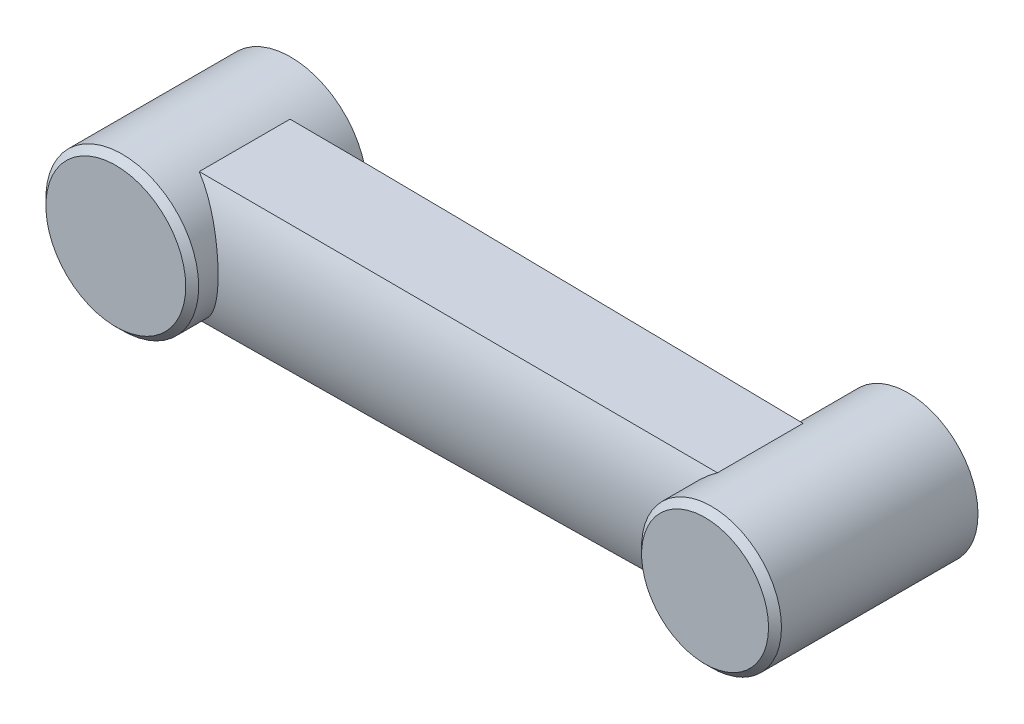
ISO-10303-21;
HEADER;
FILE_DESCRIPTION(('STEP AP214'),'2;1');
FILE_NAME('part.step','',(''),(''),'','','');
FILE_SCHEMA(('AUTOMOTIVE_DESIGN { 1 0 10303 214 1 1 1 1 }'));
ENDSEC;
DATA;
#1=APPLICATION_CONTEXT('core data for automotive mechanical design processes');
#2=APPLICATION_PROTOCOL_DEFINITION('international standard','automotive_design',2000,#1);
#3=PRODUCT_CONTEXT('',#1,'mechanical');
#4=PRODUCT('Part','Part','',(#3));
#5=PRODUCT_RELATED_PRODUCT_CATEGORY('part','',(#4));
#6=PRODUCT_DEFINITION_FORMATION('','',#4);
#7=PRODUCT_DEFINITION_CONTEXT('part definition',#1,'design');
#8=PRODUCT_DEFINITION('design','',#6,#7);
#9=PRODUCT_DEFINITION_SHAPE('','',#8);
#10=(LENGTH_UNIT() NAMED_UNIT(*) SI_UNIT(.MILLI.,.METRE.));
#11=(NAMED_UNIT(*) PLANE_ANGLE_UNIT() SI_UNIT($,.RADIAN.));
#12=(NAMED_UNIT(*) SI_UNIT($,.STERADIAN.) SOLID_ANGLE_UNIT());
#13=UNCERTAINTY_MEASURE_WITH_UNIT(LENGTH_MEASURE(1.E-05),#10,'distance_accuracy_value','');
#14=(GEOMETRIC_REPRESENTATION_CONTEXT(3) GLOBAL_UNCERTAINTY_ASSIGNED_CONTEXT((#13)) GLOBAL_UNIT_ASSIGNED_CONTEXT((#10,
#11,#12)) REPRESENTATION_CONTEXT('',''));
#15=CARTESIAN_POINT('',(0.,0.,0.));
#16=DIRECTION('',(0.,0.,1.));
#17=DIRECTION('',(1.,0.,0.));
#18=AXIS2_PLACEMENT_3D('',#15,#16,#17);
#19=CARTESIAN_POINT('',(0.,0.,-67.5));
#20=DIRECTION('',(0.,0.,1.));
#21=DIRECTION('',(1.,0.,0.));
#22=AXIS2_PLACEMENT_3D('',#19,#20,#21);
#23=CYLINDRICAL_SURFACE('',#22,59.);
#24=CARTESIAN_POINT('',(31.9740311601323,49.5848901518486,35.0305973719654));
#25=CARTESIAN_POINT('',(32.9304360325345,48.9681514411799,35.3577116607508));
#26=CARTESIAN_POINT('',(33.867371250846,48.3248222336151,35.6914017968084));
#27=CARTESIAN_POINT('',(35.7005284824138,46.9868104598781,36.3675515039722));
#28=CARTESIAN_POINT('',(36.5967506826888,46.2921281296394,36.7100110347842));
#29=CARTESIAN_POINT('',(38.3467433347092,44.8532102287219,37.3993308094669));
#30=CARTESIAN_POINT('',(39.2005124983065,44.1089731560094,37.7461911864717));
#31=CARTESIAN_POINT('',(40.86773612587,42.5690263074108,38.4416823044257));
#32=CARTESIAN_POINT('',(41.6809811748522,41.7730900606422,38.7903136706081));
#33=CARTESIAN_POINT('',(43.2609274343158,40.1346150826013,39.4834753155778));
#34=CARTESIAN_POINT('',(44.0276292800337,39.2920769876661,39.8280056502857));
#35=CARTESIAN_POINT('',(45.5125264680201,37.5620738996725,40.5088449534623));
#36=CARTESIAN_POINT('',(46.2307207501042,36.6746079254087,40.8451537421381));
#37=CARTESIAN_POINT('',(47.6175020547784,34.8551836253867,41.5060055371013));
#38=CARTESIAN_POINT('',(48.2860116656513,33.9231594397871,41.8305297961186));
#39=CARTESIAN_POINT('',(49.5699012276593,32.0178771900482,42.4633079236318));
#40=CARTESIAN_POINT('',(50.1852814395842,31.0446193283425,42.7715618719889));
#41=CARTESIAN_POINT('',(51.3604911844395,29.0590915569938,43.3679645738402));
#42=CARTESIAN_POINT('',(51.9203186814566,28.0468202194588,43.6561125903711));
#43=CARTESIAN_POINT('',(52.980805923971,25.987928433065,44.2080429791045));
#44=CARTESIAN_POINT('',(53.4815795281318,24.9413792244473,44.4718720175395));
#45=CARTESIAN_POINT('',(54.4226393369657,22.8150816066782,44.9722940527259));
#46=CARTESIAN_POINT('',(54.8629265238624,21.7353337369799,45.2088874917392));
#47=CARTESIAN_POINT('',(55.6804444426601,19.5461770807239,45.6515640213008));
#48=CARTESIAN_POINT('',(56.0576807918225,18.4367709466761,45.857649829617));
#49=CARTESIAN_POINT('',(56.7224863858762,16.271163261399,46.2230623499148));
#50=CARTESIAN_POINT('',(57.0144956826848,15.2167064320586,46.3846581155369));
#51=CARTESIAN_POINT('',(57.5402068191384,13.0891257359792,46.6768820279923));
#52=CARTESIAN_POINT('',(57.7739102967918,12.0160023945521,46.8075110447816));
#53=CARTESIAN_POINT('',(58.1815072683751,9.8550089512454,47.0360783759849));
#54=CARTESIAN_POINT('',(58.3554012793752,8.76713897693936,47.1340169730168));
#55=CARTESIAN_POINT('',(58.6421552636753,6.58120826703925,47.2958542186268));
#56=CARTESIAN_POINT('',(58.7550346982691,5.48315089463223,47.3597637210747));
#57=CARTESIAN_POINT('',(58.9190509440168,3.28095591978354,47.4527121308527));
#58=CARTESIAN_POINT('',(58.9701868503218,2.17681822847323,47.4817505271481));
#59=CARTESIAN_POINT('',(59.0103347052788,-0.0328654417600012,47.5045437854242));
#60=CARTESIAN_POINT('',(58.9993548312895,-1.13841121615548,47.4983032917664));
#61=CARTESIAN_POINT('',(58.9294484731735,-2.97665624244058,47.4586317868899));
#62=CARTESIAN_POINT('',(58.8878015966407,-3.71028706818472,47.4350015864898));
#63=CARTESIAN_POINT('',(58.7772045530079,-5.17488753863604,47.3723290422645));
#64=CARTESIAN_POINT('',(58.7082530720658,-5.90585705357802,47.3332859568027));
#65=CARTESIAN_POINT('',(58.5432748177476,-7.36362701722964,47.2400319069713));
#66=CARTESIAN_POINT('',(58.4472526053286,-8.09042814721165,47.1858234977121));
#67=CARTESIAN_POINT('',(58.2284123780737,-9.53878626195275,47.062558227753));
#68=CARTESIAN_POINT('',(58.1055918455044,-10.2603427473851,46.9934999719015));
#69=CARTESIAN_POINT('',(57.8335638536209,-11.6967102382891,46.8409707718762));
#70=CARTESIAN_POINT('',(57.684363899032,-12.4115231015024,46.7575039269848));
#71=CARTESIAN_POINT('',(57.3599681623452,-13.8335080579546,46.5766255906791));
#72=CARTESIAN_POINT('',(57.1847699434155,-14.540679428279,46.4792127921329));
#73=CARTESIAN_POINT('',(56.8088772201318,-15.9461768603359,46.2710118243063));
#74=CARTESIAN_POINT('',(56.6081844233331,-16.6445035110211,46.1602245508354));
#75=CARTESIAN_POINT('',(56.1818222170108,-18.0313440216683,45.9258963030342));
#76=CARTESIAN_POINT('',(55.9561505136098,-18.7198569738486,45.8023541574613));
#77=CARTESIAN_POINT('',(55.2394389309615,-20.7779456804182,45.4119335776907));
#78=CARTESIAN_POINT('',(54.7110621697659,-22.1312655098596,45.1265769526038));
#79=CARTESIAN_POINT('',(53.5602695379572,-24.7869476939627,44.5130573947721));
#80=CARTESIAN_POINT('',(52.9378535207291,-26.0893099691733,44.1848943952887));
#81=CARTESIAN_POINT('',(51.6032786435764,-28.6386690461376,43.4921518767575));
#82=CARTESIAN_POINT('',(50.8910396025913,-29.8856150183206,43.1275398823451));
#83=CARTESIAN_POINT('',(49.3821372352065,-32.3180022951138,42.3693384317477));
#84=CARTESIAN_POINT('',(48.5854717536823,-33.5034420285243,41.9757482359246));
#85=CARTESIAN_POINT('',(46.8170696255981,-35.9399257424218,41.1210572080882));
#86=CARTESIAN_POINT('',(45.8357265964546,-37.1830984379254,40.6573692209638));
#87=CARTESIAN_POINT('',(43.7795562342631,-39.5834377830625,39.7139398385792));
#88=CARTESIAN_POINT('',(42.7047084007367,-40.7405854684708,39.234194937175));
#89=CARTESIAN_POINT('',(40.4688543932773,-42.9622129182515,38.2706194492537));
#90=CARTESIAN_POINT('',(39.3079944584598,-44.0268435745849,37.7867969830634));
#91=CARTESIAN_POINT('',(36.9037839213652,-46.0606962845013,36.8258121369615));
#92=CARTESIAN_POINT('',(35.660480196486,-47.029971791216,36.3486461558746));
#93=CARTESIAN_POINT('',(33.9848050447994,-48.2313981538779,35.7369990562117));
#94=CARTESIAN_POINT('',(33.5874860365728,-48.5089272395702,35.594172455507));
#95=CARTESIAN_POINT('',(32.7859734482706,-49.0542004079413,35.3107015707663));
#96=CARTESIAN_POINT('',(32.3817861465551,-49.3219527895173,35.1700554970505));
#97=CARTESIAN_POINT('',(31.9740311601323,-49.5848901518486,35.0305973719654));
#98=B_SPLINE_CURVE_WITH_KNOTS('',3,(#24,#25,#26,#27,#28,#29,#30,#31,#32,#33,#34,#35,#36,#37,#38,
#39,#40,#41,#42,#43,#44,#45,#46,#47,#48,#49,#50,#51,#52,#53,#54,#55,#56,#57,#58,#59,#60,#61,#62,
#63,#64,#65,#66,#67,#68,#69,#70,#71,#72,#73,#74,#75,#76,#77,#78,#79,#80,#81,#82,#83,#84,#85,#86,
#87,#88,#89,#90,#91,#92,#93,#94,#95,#96,#97),.UNSPECIFIED.,.F.,.F.,(4,2,2,2,2,2,2,2,2,2,2,2,2,2,
2,2,2,2,2,2,2,2,2,2,2,2,2,2,2,2,2,2,2,2,2,2,4),(0.,3.55172465260012,7.10343298840976,
10.6552490276682,14.2238376408122,17.7923775377571,21.360995403715,24.9350616396155,
28.5091103309446,32.0832899567989,35.6504616495913,39.2175754091419,42.7843712014116,
46.1003442559698,49.416224143095,52.732075362754,56.0468683288858,59.3617098725978,
62.6761150373954,64.8810769012949,67.0861448763699,69.2908415568576,71.4957454604299,
73.7000230936219,75.904507465624,78.1088442652184,80.3133836629595,84.7500150465471,
89.1866533472805,93.6272804502781,98.0680209349458,103.013793133484,107.960652414824,
112.899285883446,117.835134941287,119.350802429502,120.865151937714),.UNSPECIFIED.);
#99=CARTESIAN_POINT('',(31.9740311601324,49.5848901518486,35.0305973719654));
#100=VERTEX_POINT('',#99);
#101=CARTESIAN_POINT('',(31.9740311601323,-49.5848901518486,35.0305973719654));
#102=VERTEX_POINT('',#101);
#103=EDGE_CURVE('E133',#100,#102,#98,.T.);
#104=ORIENTED_EDGE('',*,*,#103,.F.);
#105=CARTESIAN_POINT('',(31.9740324272669,49.5848893347569,-35.0719652062275));
#106=CARTESIAN_POINT('',(31.9740322495242,49.5848894493714,-25.2386318728942));
#107=CARTESIAN_POINT('',(31.9740320717819,49.5848895639856,-15.4052985395608));
#108=CARTESIAN_POINT('',(31.9740317717217,49.5848897574748,1.19512855680466));
#109=CARTESIAN_POINT('',(31.9740316494036,49.5848898363497,7.9622223198368));
#110=CARTESIAN_POINT('',(31.9740314047678,49.5848899940993,21.4964098459011));
#111=CARTESIAN_POINT('',(31.97403128245,49.584890072974,28.2635036089332));
#112=CARTESIAN_POINT('',(31.9740311601323,49.5848901518485,35.0305973719654));
#113=B_SPLINE_CURVE_WITH_KNOTS('',3,(#105,#106,#107,#108,#109,#110,#111,#112),.UNSPECIFIED.,.F.,
.F.,(4,2,2,4),(0.,29.5,49.8012812890964,70.1025625781929),.UNSPECIFIED.);
#114=CARTESIAN_POINT('',(31.9740324272669,49.5848893347569,-35.0719652062275));
#115=VERTEX_POINT('',#114);
#116=EDGE_CURVE('E209',#115,#100,#113,.T.);
#117=ORIENTED_EDGE('',*,*,#116,.F.);
#118=CARTESIAN_POINT('',(31.9740324272669,-49.5848893347569,-35.0719652062275));
#119=CARTESIAN_POINT('',(32.9277070901544,-48.9699113606573,-35.4018941567407));
#120=CARTESIAN_POINT('',(33.8622236052316,-48.3283647502664,-35.7375064476293));
#121=CARTESIAN_POINT('',(35.691184805053,-46.9938434625281,-36.4158563307537));
#122=CARTESIAN_POINT('',(36.5856271971111,-46.3008658487645,-36.7585943290211));
#123=CARTESIAN_POINT('',(38.3326149613646,-44.8652297782699,-37.4469312290839));
#124=CARTESIAN_POINT('',(39.1851584254863,-44.1225690626046,-37.7925302603346));
#125=CARTESIAN_POINT('',(40.8502746108914,-42.5857320720737,-38.4840737613084));
#126=CARTESIAN_POINT('',(41.6626461205552,-41.791335188857,-38.8300125482235));
#127=CARTESIAN_POINT('',(43.2412209119085,-40.155802423974,-39.5166107772993));
#128=CARTESIAN_POINT('',(44.0074255441812,-39.314667910973,-39.8572703736828));
#129=CARTESIAN_POINT('',(45.4916180175642,-37.5873554793924,-40.5294249658318));
#130=CARTESIAN_POINT('',(46.2096051469471,-36.7011768962669,-40.8609198262764));
#131=CARTESIAN_POINT('',(47.5963189850297,-34.8840771823359,-41.5115067312934));
#132=CARTESIAN_POINT('',(48.2649585968985,-33.9530815187342,-41.8305763982316));
#133=CARTESIAN_POINT('',(49.5492328328238,-32.049827166788,-42.452002766381));
#134=CARTESIAN_POINT('',(50.1648672852781,-31.0775683448711,-42.7543594134832));
#135=CARTESIAN_POINT('',(51.3406551592363,-29.0940937001846,-43.3387814776432));
#136=CARTESIAN_POINT('',(51.9008066107118,-28.0828764958938,-43.6208461740999));
#137=CARTESIAN_POINT('',(52.9620049008276,-26.0261871361385,-44.1607036177853));
#138=CARTESIAN_POINT('',(53.4631637557532,-24.9807848801136,-44.4185421717898));
#139=CARTESIAN_POINT('',(54.4050406103352,-22.8569668107564,-44.907306145159));
#140=CARTESIAN_POINT('',(54.8457596037591,-21.7785515405892,-45.1382320070196));
#141=CARTESIAN_POINT('',(55.6642125503893,-19.5922842561683,-45.5701350040963));
#142=CARTESIAN_POINT('',(56.0419520761777,-18.4844348563879,-45.7711147888494));
#143=CARTESIAN_POINT('',(56.707762427989,-16.3222988186178,-46.1273864231467));
#144=CARTESIAN_POINT('',(57.0002787665418,-15.2697460443785,-46.2849009856841));
#145=CARTESIAN_POINT('',(57.5271665173899,-13.1461698610171,-46.5698036388793));
#146=CARTESIAN_POINT('',(57.7615396514758,-12.0751469998532,-46.6971926216385));
#147=CARTESIAN_POINT('',(58.1706785679011,-9.91850614679235,-46.9202499810359));
#148=CARTESIAN_POINT('',(58.3454448677288,-8.83288828168985,-47.0159186330599));
#149=CARTESIAN_POINT('',(58.6341867905499,-6.65148374975244,-47.1742881213884));
#150=CARTESIAN_POINT('',(58.7481782357063,-5.55569980521607,-47.2369975382599));
#151=CARTESIAN_POINT('',(58.9146661709657,-3.35805620073878,-47.3286685411012));
#152=CARTESIAN_POINT('',(58.9671617824277,-2.25619645421392,-47.3576296448812));
#153=CARTESIAN_POINT('',(59.010280825659,-0.050974048546858,-47.3814132723774));
#154=CARTESIAN_POINT('',(59.0009117818993,1.05238841150293,-47.3762399477939));
#155=CARTESIAN_POINT('',(58.9336767778032,2.8928094071489,-47.3391670972398));
#156=CARTESIAN_POINT('',(58.8928130474054,3.63073778271643,-47.3166384432703));
#157=CARTESIAN_POINT('',(58.7834573839508,5.10398472901763,-47.2564204995798));
#158=CARTESIAN_POINT('',(58.7149640938793,5.83930316977569,-47.218730465214));
#159=CARTESIAN_POINT('',(58.550571328926,7.30581767424513,-47.1284171443396));
#160=CARTESIAN_POINT('',(58.4546763089467,8.03701438836757,-47.0757962852556));
#161=CARTESIAN_POINT('',(58.2357545081391,9.49419651465895,-46.9559202337395));
#162=CARTESIAN_POINT('',(58.1127251807189,10.2201814310859,-46.8886636677341));
#163=CARTESIAN_POINT('',(57.8399406875968,11.6654137876361,-46.7399273984824));
#164=CARTESIAN_POINT('',(57.6901935037988,12.3846631726282,-46.6584519432581));
#165=CARTESIAN_POINT('',(57.3643592935442,13.8155253880066,-46.4817172539954));
#166=CARTESIAN_POINT('',(57.188269797025,14.5271374955483,-46.3864567273878));
#167=CARTESIAN_POINT('',(56.8102483717203,15.9414997457357,-46.1826892757002));
#168=CARTESIAN_POINT('',(56.6083182294795,16.6442504973426,-46.0741832663969));
#169=CARTESIAN_POINT('',(56.1791347185434,18.0399023327007,-45.8445118698443));
#170=CARTESIAN_POINT('',(55.9518790210226,18.7328025040194,-45.7233453184516));
#171=CARTESIAN_POINT('',(55.2302552998176,20.8029253571485,-45.3403709996424));
#172=CARTESIAN_POINT('',(54.6981015818668,22.1638371619218,-45.0602121015555));
#173=CARTESIAN_POINT('',(53.538553398412,24.8343172559177,-44.4570623651124));
#174=CARTESIAN_POINT('',(52.9111587909087,26.1438854685858,-44.134071462896));
#175=CARTESIAN_POINT('',(51.5655371330691,28.7070034029858,-43.4513094512989));
#176=CARTESIAN_POINT('',(50.8472317674307,29.9605035494483,-43.091506682069));
#177=CARTESIAN_POINT('',(49.3252497652151,32.4051435939102,-42.3421881137325));
#178=CARTESIAN_POINT('',(48.5215711855363,33.5962820716314,-41.9526716383965));
#179=CARTESIAN_POINT('',(46.7436825558724,36.035281848161,-41.1083527712924));
#180=CARTESIAN_POINT('',(45.7604264127738,37.2756785709276,-40.6510150068997));
#181=CARTESIAN_POINT('',(43.7010291084835,39.6700683954305,-39.7186603353378));
#182=CARTESIAN_POINT('',(42.6248680681233,40.8240429059811,-39.2436396569265));
#183=CARTESIAN_POINT('',(40.3872090665606,43.0389111031917,-38.2872770393788));
#184=CARTESIAN_POINT('',(39.2258537892059,44.0999541747324,-37.8059467302617));
#185=CARTESIAN_POINT('',(36.8217103916279,46.1262503545211,-36.8472392897261));
#186=CARTESIAN_POINT('',(35.5789679853686,47.0915564835146,-36.3698601059032));
#187=CARTESIAN_POINT('',(33.9172948596202,48.2787350753209,-35.7605323887458));
#188=CARTESIAN_POINT('',(33.5330994076732,48.5463775399655,-35.621565516139));
#189=CARTESIAN_POINT('',(32.7583750431931,49.0724752265889,-35.3453999243069));
#190=CARTESIAN_POINT('',(32.3678519303223,49.3309382373385,-35.2081997722437));
#191=CARTESIAN_POINT('',(31.9740324272669,49.5848893347569,-35.0719652062275));
#192=B_SPLINE_CURVE_WITH_KNOTS('',3,(#118,#119,#120,#121,#122,#123,#124,#125,#126,#127,#128,
#129,#130,#131,#132,#133,#134,#135,#136,#137,#138,#139,#140,#141,#142,#143,#144,#145,#146,#147,
#148,#149,#150,#151,#152,#153,#154,#155,#156,#157,#158,#159,#160,#161,#162,#163,#164,#165,#166,
#167,#168,#169,#170,#171,#172,#173,#174,#175,#176,#177,#178,#179,#180,#181,#182,#183,#184,#185,
#186,#187,#188,#189,#190,#191),.UNSPECIFIED.,.F.,.F.,(4,2,2,2,2,2,2,2,2,2,2,2,2,2,2,2,2,2,2,2,2,
2,2,2,2,2,2,2,2,2,2,2,2,2,2,2,4),(0.,3.54473328378365,7.08966910748394,10.6347662179481,
14.1961193347504,17.7573682157397,21.3186696519402,24.8861133794018,28.4535686558863,
32.0211505562068,35.5818450880689,39.1424810670707,42.7028018246334,46.0119899479278,
49.3210800647728,52.6301414523836,55.938340935731,59.2465876854376,62.5544320673009,
64.7720212687833,66.9897193995242,69.2070571875583,71.4246031643927,73.6414877598922,
75.8585803583822,78.0755197564746,80.2926631829417,84.7511317022058,89.2096068688853,
93.6719492812616,98.1343932786964,103.07198257406,108.010631012881,112.941189135045,
117.869001200896,119.334160773358,120.798045917664),.UNSPECIFIED.);
#193=CARTESIAN_POINT('',(31.9740324272669,-49.5848893347569,-35.0719652062275));
#194=VERTEX_POINT('',#193);
#195=EDGE_CURVE('E118',#194,#115,#192,.T.);
#196=ORIENTED_EDGE('',*,*,#195,.F.);
#197=CARTESIAN_POINT('',(31.9740311601323,-49.5848901518486,35.0305973719654));
#198=CARTESIAN_POINT('',(31.9740313378733,-49.5848900372351,25.197264038632));
#199=CARTESIAN_POINT('',(31.9740315156146,-49.5848899226214,15.3639307052987));
#200=CARTESIAN_POINT('',(31.9740318156744,-49.5848897291326,-1.23649639106678));
#201=CARTESIAN_POINT('',(31.9740319379927,-49.5848896502576,-8.00359015409892));
#202=CARTESIAN_POINT('',(31.9740321826295,-49.5848894925074,-21.5377776801632));
#203=CARTESIAN_POINT('',(31.9740323049481,-49.5848894136322,-28.3048714431953));
#204=CARTESIAN_POINT('',(31.9740324272668,-49.5848893347569,-35.0719652062275));
#205=B_SPLINE_CURVE_WITH_KNOTS('',3,(#197,#198,#199,#200,#201,#202,#203,#204),.UNSPECIFIED.,.F.,
.F.,(4,2,2,4),(0.,29.5,49.8012812890965,70.1025625781929),.UNSPECIFIED.);
#206=EDGE_CURVE('E137',#102,#194,#205,.T.);
#207=ORIENTED_EDGE('',*,*,#206,.F.);
#208=EDGE_LOOP('',(#104,#117,#196,#207));
#209=FACE_BOUND('',#208,.T.);
#210=CARTESIAN_POINT('',(0.,0.,62.5));
#211=DIRECTION('',(0.,0.,1.));
#212=DIRECTION('',(1.,0.,0.));
#213=AXIS2_PLACEMENT_3D('',#210,#211,#212);
#214=CIRCLE('',#213,59.);
#215=CARTESIAN_POINT('',(59.,0.,62.5));
#216=VERTEX_POINT('',#215);
#217=EDGE_CURVE('E230',#216,#216,#214,.F.);
#218=ORIENTED_EDGE('',*,*,#217,.T.);
#219=EDGE_LOOP('',(#218));
#220=FACE_BOUND('',#219,.T.);
#221=CARTESIAN_POINT('',(0.,0.,-67.5));
#222=DIRECTION('',(0.,0.,1.));
#223=DIRECTION('',(1.,0.,0.));
#224=AXIS2_PLACEMENT_3D('',#221,#222,#223);
#225=CIRCLE('',#224,59.);
#226=CARTESIAN_POINT('',(59.,0.,-67.5));
#227=VERTEX_POINT('',#226);
#228=EDGE_CURVE('E121',#227,#227,#225,.T.);
#229=ORIENTED_EDGE('',*,*,#228,.T.);
#230=EDGE_LOOP('',(#229));
#231=FACE_BOUND('',#230,.T.);
#232=ADVANCED_FACE('F68',(#209,#220,#231),#23,.T.);
#233=CARTESIAN_POINT('',(0.,0.,-67.5));
#234=DIRECTION('',(0.,0.,1.));
#235=DIRECTION('',(1.,0.,0.));
#236=AXIS2_PLACEMENT_3D('',#233,#234,#235);
#237=PLANE('',#236);
#238=ORIENTED_EDGE('',*,*,#228,.F.);
#239=EDGE_LOOP('',(#238));
#240=FACE_BOUND('',#239,.T.);
#241=ADVANCED_FACE('F218',(#240),#237,.F.);
#242=CARTESIAN_POINT('',(0.,0.,67.5));
#243=DIRECTION('',(0.,0.,1.));
#244=DIRECTION('',(1.,0.,0.));
#245=AXIS2_PLACEMENT_3D('',#242,#243,#244);
#246=PLANE('',#245);
#247=CARTESIAN_POINT('',(0.,0.,67.5));
#248=DIRECTION('',(0.,0.,1.));
#249=DIRECTION('',(1.,0.,0.));
#250=AXIS2_PLACEMENT_3D('',#247,#248,#249);
#251=CIRCLE('',#250,54.);
#252=CARTESIAN_POINT('',(54.,0.,67.5));
#253=VERTEX_POINT('',#252);
#254=EDGE_CURVE('E233',#253,#253,#251,.T.);
#255=ORIENTED_EDGE('',*,*,#254,.T.);
#256=EDGE_LOOP('',(#255));
#257=FACE_BOUND('',#256,.T.);
#258=ADVANCED_FACE('F272',(#257),#246,.T.);
#259=CARTESIAN_POINT('',(0.,0.,67.5));
#260=DIRECTION('',(0.,0.,-1.));
#261=DIRECTION('',(-1.,0.,0.));
#262=AXIS2_PLACEMENT_3D('',#259,#260,#261);
#263=CONICAL_SURFACE('',#262,54.,0.785398163397444);
#264=ORIENTED_EDGE('',*,*,#217,.F.);
#265=EDGE_LOOP('',(#264));
#266=FACE_BOUND('',#265,.T.);
#267=ORIENTED_EDGE('',*,*,#254,.F.);
#268=EDGE_LOOP('',(#267));
#269=FACE_BOUND('',#268,.T.);
#270=ADVANCED_FACE('F221',(#266,#269),#263,.T.);
#271=CARTESIAN_POINT('',(0.,49.5,35.044213698551));
#272=CARTESIAN_POINT('',(19.6680177485169,49.6460295711744,35.0739054868768));
#273=CARTESIAN_POINT('',(154.335221457092,49.2411532004611,34.7064713830917));
#274=CARTESIAN_POINT('',(306.999873812123,47.3055147465386,33.7156339735831));
#275=CARTESIAN_POINT('',(440.000026498505,46.1867917494992,33.0357588080376));
#276=CARTESIAN_POINT('',(458.,46.0299999999999,32.9345424362905));
#277=CARTESIAN_POINT('',(0.,18.551717300171,51.4862529347825));
#278=CARTESIAN_POINT('',(19.6680177485169,18.6003938238958,51.5159447231083));
#279=CARTESIAN_POINT('',(154.335221457092,18.7597641279317,52.3413157086805));
#280=CARTESIAN_POINT('',(306.999873812123,17.6438091659472,49.1641627882075));
#281=CARTESIAN_POINT('',(440.000026498505,17.1422318740338,47.6642845076983));
#282=CARTESIAN_POINT('',(458.,17.0899679575341,47.5630681359511));
#283=CARTESIAN_POINT('',(0.,-18.551717300171,51.4862529347824));
#284=CARTESIAN_POINT('',(19.6680177485169,-18.6003938238958,51.5159447231083));
#285=CARTESIAN_POINT('',(154.335221457092,-18.7597641279316,52.3413157086806));
#286=CARTESIAN_POINT('',(306.999873812123,-17.6438091659474,49.1641627882075));
#287=CARTESIAN_POINT('',(440.000026498505,-17.1422318740339,47.6642845076983));
#288=CARTESIAN_POINT('',(458.,-17.0899679575342,47.5630681359511));
#289=CARTESIAN_POINT('',(0.,-49.5,35.0442136985509));
#290=CARTESIAN_POINT('',(19.6680177485169,-49.6460295711744,35.0739054868768));
#291=CARTESIAN_POINT('',(154.335221457092,-49.2411532004611,34.7064713830918));
#292=CARTESIAN_POINT('',(306.999873812123,-47.3055147465387,33.7156339735831));
#293=CARTESIAN_POINT('',(440.000026498505,-46.1867917494992,33.0357588080376));
#294=CARTESIAN_POINT('',(458.,-46.03,32.9345424362905));
#295=B_SPLINE_SURFACE_WITH_KNOTS('',3,3,((#271,#272,#273,#274,#275,#276),(#277,#278,#279,#280,
#281,#282),(#283,#284,#285,#286,#287,#288),(#289,#290,#291,#292,#293,#294)),.UNSPECIFIED.,.F.,
.F.,.F.,(4,4),(4,1,1,4),(0.,1.),(0.,0.128816091573021,0.882095389623111,1.),.UNSPECIFIED.);
#296=CARTESIAN_POINT('',(430.160230199329,46.2703708375634,33.0854720073416));
#297=CARTESIAN_POINT('',(429.266589473264,45.7326809928837,33.3659088258232));
#298=CARTESIAN_POINT('',(428.390058801207,45.1700401822062,33.6528017744691));
#299=CARTESIAN_POINT('',(426.673064637878,43.9966412357655,34.2356622838595));
#300=CARTESIAN_POINT('',(425.832598134816,43.3858871301647,34.5316290832761));
#301=CARTESIAN_POINT('',(424.189425566955,42.1179528048515,35.1288491874646));
#302=CARTESIAN_POINT('',(423.386719670867,41.4607723777433,35.4301025158481));
#303=CARTESIAN_POINT('',(421.817919284519,40.099125055347,36.0353006337197));
#304=CARTESIAN_POINT('',(421.051970212929,39.3944932272536,36.3392512460576));
#305=CARTESIAN_POINT('',(419.561617500338,37.9417133163282,36.9450912788229));
#306=CARTESIAN_POINT('',(418.837214073518,37.1935650091944,37.2469806886171));
#307=CARTESIAN_POINT('',(417.431836478404,35.6554274349182,37.8451149518454));
#308=CARTESIAN_POINT('',(416.750863347313,34.8654371693287,38.1413596703545));
#309=CARTESIAN_POINT('',(415.10411646393,32.838988452244,38.8710088808596));
#310=CARTESIAN_POINT('',(414.166696582593,31.5772368060244,39.2987268884049));
#311=CARTESIAN_POINT('',(412.401143818374,28.9693471558795,40.1221512905258));
#312=CARTESIAN_POINT('',(411.573010773551,27.623209277003,40.5178577325362));
#313=CARTESIAN_POINT('',(410.419215944175,25.5478936798855,41.0788654292634));
#314=CARTESIAN_POINT('',(410.049546944586,24.8472071312775,41.2603436186273));
#315=CARTESIAN_POINT('',(409.34031834658,23.4278575666769,41.611314431191));
#316=CARTESIAN_POINT('',(409.000755354485,22.7091965885777,41.7808084048654));
#317=CARTESIAN_POINT('',(408.352673957758,21.2550399174321,42.1065844292086));
#318=CARTESIAN_POINT('',(408.044156865772,20.5195435141818,42.2628659211976));
#319=CARTESIAN_POINT('',(407.45915287533,19.0331459899038,42.5610271065165));
#320=CARTESIAN_POINT('',(407.182662939924,18.282246337439,42.7029081651984));
#321=CARTESIAN_POINT('',(406.595227852216,16.5700615703002,43.0059411721971));
#322=CARTESIAN_POINT('',(406.293901310107,15.6046499878695,43.1625691056991));
#323=CARTESIAN_POINT('',(405.745120197684,13.6547920939884,43.4493124570204));
#324=CARTESIAN_POINT('',(405.497664553291,12.6703461624712,43.5794284034326));
#325=CARTESIAN_POINT('',(405.058099100137,10.6858740216661,43.8114746952255));
#326=CARTESIAN_POINT('',(404.86598916995,9.68584784656522,43.9134051024434));
#327=CARTESIAN_POINT('',(404.538411477936,7.67439981743157,44.0876896092647));
#328=CARTESIAN_POINT('',(404.402921445703,6.66298260491612,44.1600553373455));
#329=CARTESIAN_POINT('',(404.189375547011,4.63238523768931,44.2742892517999));
#330=CARTESIAN_POINT('',(404.111320235871,3.61320500801599,44.3161571432993));
#331=CARTESIAN_POINT('',(404.013193083353,1.57132712662651,44.3688113874102));
#332=CARTESIAN_POINT('',(403.993113912643,0.548629935891649,44.3796016688473));
#333=CARTESIAN_POINT('',(404.008078500159,-1.15809022179518,44.3715672275615));
#334=CARTESIAN_POINT('',(404.027099196463,-1.84235016304926,44.3613506644733));
#335=CARTESIAN_POINT('',(404.091112657909,-3.20936108105202,44.3269992938666));
#336=CARTESIAN_POINT('',(404.136106702823,-3.89211198178234,44.3028638005273));
#337=CARTESIAN_POINT('',(404.251922147742,-5.25467244413948,44.2408257608947));
#338=CARTESIAN_POINT('',(404.322739378685,-5.93448246264488,44.2029254368886));
#339=CARTESIAN_POINT('',(404.489994358461,-7.29011398106553,44.1135855937861));
#340=CARTESIAN_POINT('',(404.586434544661,-7.96593509528391,44.0621447866644));
#341=CARTESIAN_POINT('',(404.804616895966,-9.31214602208754,43.9460525620598));
#342=CARTESIAN_POINT('',(404.926352206436,-9.98253725506761,43.881404723582));
#343=CARTESIAN_POINT('',(405.194800928469,-11.316988244955,43.7392699756013));
#344=CARTESIAN_POINT('',(405.341516740701,-11.9810473868546,43.6617818321426));
#345=CARTESIAN_POINT('',(405.659503043512,-13.3016374716948,43.4944292254928));
#346=CARTESIAN_POINT('',(405.830771665485,-13.9581689834273,43.4045657041577));
#347=CARTESIAN_POINT('',(406.197411342901,-15.262735716766,43.2129792899158));
#348=CARTESIAN_POINT('',(406.392784628833,-15.9107701459602,43.1112552995663));
#349=CARTESIAN_POINT('',(407.012056802879,-17.8335495292363,42.7903155683726));
#350=CARTESIAN_POINT('',(407.470921052689,-19.0944718923946,42.5543711557633));
#351=CARTESIAN_POINT('',(408.477753312623,-21.5716348640888,42.0429041793046));
#352=CARTESIAN_POINT('',(409.025720639796,-22.7878758150075,41.7673819188101));
#353=CARTESIAN_POINT('',(410.206732375681,-25.1708757450324,41.1822216778842));
#354=CARTESIAN_POINT('',(410.839835913635,-26.3375995856316,40.8725600139508));
#355=CARTESIAN_POINT('',(412.186288421321,-28.6156391163922,40.2254302755231));
#356=CARTESIAN_POINT('',(412.899639731814,-29.7269531889318,39.8879613899925));
#357=CARTESIAN_POINT('',(414.476054854063,-31.9962126443468,39.1574653682981));
#358=CARTESIAN_POINT('',(415.346941427367,-33.1480203425407,38.7622367185606));
#359=CARTESIAN_POINT('',(417.174932243713,-35.3749861936075,37.9548799430589));
#360=CARTESIAN_POINT('',(418.132051897696,-36.4501305840306,37.5427488038047));
#361=CARTESIAN_POINT('',(420.126194276248,-38.517994070725,36.711353677916));
#362=CARTESIAN_POINT('',(421.163126006245,-39.5108044296727,36.2920982267561));
#363=CARTESIAN_POINT('',(423.312758294367,-41.4107679359785,35.4556602079478));
#364=CARTESIAN_POINT('',(424.425425283357,-42.3179586135818,35.0384768087298));
#365=CARTESIAN_POINT('',(426.310151981239,-43.7333055732774,34.3634536224146));
#366=CARTESIAN_POINT('',(427.061264484724,-44.2678926503507,34.1021225367239));
#367=CARTESIAN_POINT('',(428.590527610387,-45.2982494210123,33.5873431353075));
#368=CARTESIAN_POINT('',(429.368636884365,-45.7940749943299,33.333883801708));
#369=CARTESIAN_POINT('',(430.160230199329,-46.2703708375635,33.0854720073416));
#370=B_SPLINE_CURVE_WITH_KNOTS('',3,(#296,#297,#298,#299,#300,#301,#302,#303,#304,#305,#306,
#307,#308,#309,#310,#311,#312,#313,#314,#315,#316,#317,#318,#319,#320,#321,#322,#323,#324,#325,
#326,#327,#328,#329,#330,#331,#332,#333,#334,#335,#336,#337,#338,#339,#340,#341,#342,#343,#344,
#345,#346,#347,#348,#349,#350,#351,#352,#353,#354,#355,#356,#357,#358,#359,#360,#361,#362,#363,
#364,#365,#366,#367,#368,#369),.UNSPECIFIED.,.F.,.F.,(4,2,2,2,2,2,2,2,2,2,2,2,2,2,2,2,2,2,2,2,2,
2,2,2,2,2,2,2,2,2,2,2,2,2,2,2,4),(0.,3.23940272456287,6.47853439171408,9.71768052964244,
12.9687328693705,16.2198019678449,19.4709486794155,24.3518521295834,29.232748347104,
31.6702760063698,34.1075285468595,36.5448840932369,38.9820083296836,42.0502421953946,
45.1184148810101,48.1865808351945,51.2535388436723,54.3205265052281,57.3871264217608,
59.4403479292066,61.4936706126959,63.5466619411549,65.5998486290213,67.652479655195,
69.7053080541318,71.7579803042062,73.8108426378959,77.8933062711915,81.975738615033,
86.0610210975521,90.1464227752428,94.6330159211063,99.1204124743112,103.602766598336,
108.08314672708,110.956796701707,113.826224465866),.UNSPECIFIED.);
#371=CARTESIAN_POINT('',(430.160230199329,46.2703708375634,33.0854720073416));
#372=VERTEX_POINT('',#371);
#373=CARTESIAN_POINT('',(430.160230199329,-46.2703708375635,33.0854720073416));
#374=VERTEX_POINT('',#373);
#375=EDGE_CURVE('E91',#372,#374,#370,.T.);
#376=CARTESIAN_POINT('',(0.,49.5,35.044213698551));
#377=CARTESIAN_POINT('',(19.6680177485169,49.6460295711744,35.0739054868768));
#378=CARTESIAN_POINT('',(154.335221457092,49.2411532004611,34.7064713830917));
#379=CARTESIAN_POINT('',(306.999873812123,47.3055147465386,33.7156339735831));
#380=CARTESIAN_POINT('',(440.000026498505,46.1867917494992,33.0357588080376));
#381=CARTESIAN_POINT('',(458.,46.0299999999999,32.9345424362905));
#382=B_SPLINE_CURVE_WITH_KNOTS('',3,(#376,#377,#378,#379,#380,#381),.UNSPECIFIED.,.F.,.F.,(4,1,
1,4),(0.,0.128816091573021,0.882095389623111,1.),.UNSPECIFIED.);
#383=EDGE_CURVE('E127',#372,#100,#382,.F.);
#384=CARTESIAN_POINT('',(0.,-49.5,35.0442136985509));
#385=CARTESIAN_POINT('',(19.6680177485169,-49.6460295711744,35.0739054868768));
#386=CARTESIAN_POINT('',(154.335221457092,-49.2411532004611,34.7064713830918));
#387=CARTESIAN_POINT('',(306.999873812123,-47.3055147465387,33.7156339735831));
#388=CARTESIAN_POINT('',(440.000026498505,-46.1867917494992,33.0357588080376));
#389=CARTESIAN_POINT('',(458.,-46.03,32.9345424362905));
#390=B_SPLINE_CURVE_WITH_KNOTS('',3,(#384,#385,#386,#387,#388,#389),.UNSPECIFIED.,.F.,.F.,(4,1,
1,4),(0.,0.128816091573021,0.882095389623111,1.),.UNSPECIFIED.);
#391=EDGE_CURVE('E238',#102,#374,#390,.T.);
#392=ORIENTED_EDGE('',*,*,#375,.F.);
#393=ORIENTED_EDGE('',*,*,#383,.T.);
#394=ORIENTED_EDGE('',*,*,#103,.T.);
#395=ORIENTED_EDGE('',*,*,#391,.T.);
#396=EDGE_LOOP('',(#392,#393,#394,#395));
#397=FACE_BOUND('',#396,.T.);
#398=ADVANCED_FACE('F165',(#397),#295,.T.);
#399=CARTESIAN_POINT('',(0.,-49.5,35.044213698551));
#400=CARTESIAN_POINT('',(19.6680177485169,-49.6460295711744,35.0739054868768));
#401=CARTESIAN_POINT('',(154.335221457092,-49.2411532004612,34.7064713830917));
#402=CARTESIAN_POINT('',(306.999873812123,-47.3055147465387,33.7156339735831));
#403=CARTESIAN_POINT('',(440.000026498505,-46.1867917494992,33.0357588080376));
#404=CARTESIAN_POINT('',(458.,-46.03,32.9345424362905));
#405=CARTESIAN_POINT('',(0.,-49.5,11.7108803652176));
#406=CARTESIAN_POINT('',(19.6681035415422,-49.6460289340975,11.6817421151751));
#407=CARTESIAN_POINT('',(154.334968566597,-49.2411550825421,11.4776153512319));
#408=CARTESIAN_POINT('',(306.999934716337,-47.3055142382841,11.2637374532114));
#409=CARTESIAN_POINT('',(440.000012638118,-46.1867918700394,11.0380391000065));
#410=CARTESIAN_POINT('',(458.,-46.03,11.0013572219645));
#411=CARTESIAN_POINT('',(0.,-49.5,-11.6224529681157));
#412=CARTESIAN_POINT('',(19.6681893345675,-49.6460282970206,-11.7104212565266));
#413=CARTESIAN_POINT('',(154.334715676101,-49.2411569646229,-11.7512406806279));
#414=CARTESIAN_POINT('',(306.999995620552,-47.3055137300294,-11.1881590671602));
#415=CARTESIAN_POINT('',(439.999998777731,-46.1867919905797,-10.9596806080246));
#416=CARTESIAN_POINT('',(458.,-46.03,-10.9318279923614));
#417=CARTESIAN_POINT('',(0.,-49.5,-34.9557863014491));
#418=CARTESIAN_POINT('',(19.6682751275929,-49.6460276599436,-35.1025846282283));
#419=CARTESIAN_POINT('',(154.334462785605,-49.2411588467038,-34.9800967124876));
#420=CARTESIAN_POINT('',(307.000056524766,-47.3055132217748,-33.6400555875318));
#421=CARTESIAN_POINT('',(439.999984917345,-46.1867921111199,-32.9574003160557));
#422=CARTESIAN_POINT('',(458.,-46.03,-32.8650132066874));
#423=B_SPLINE_SURFACE_WITH_KNOTS('',3,3,((#399,#400,#401,#402,#403,#404),(#405,#406,#407,#408,
#409,#410),(#411,#412,#413,#414,#415,#416),(#417,#418,#419,#420,#421,#422)),.UNSPECIFIED.,.F.,
.F.,.F.,(4,4),(4,1,1,4),(0.,1.),(0.,0.128816091573021,0.882095389623111,1.),.UNSPECIFIED.);
#424=CARTESIAN_POINT('',(430.160230199329,-46.2703708375635,33.0854720073415));
#425=CARTESIAN_POINT('',(430.160230200345,-46.2703708381749,24.0854720073415));
#426=CARTESIAN_POINT('',(430.160230201361,-46.2703708387864,15.0854720073415));
#427=CARTESIAN_POINT('',(430.160230203113,-46.2703708398405,-0.430293711864906));
#428=CARTESIAN_POINT('',(430.160230203849,-46.2703708402831,-6.94605943107134));
#429=CARTESIAN_POINT('',(430.16023020532,-46.2703708411684,-19.9775908694842));
#430=CARTESIAN_POINT('',(430.160230206056,-46.2703708416111,-26.4933565886906));
#431=CARTESIAN_POINT('',(430.160230206792,-46.2703708420537,-33.0091223078971));
#432=B_SPLINE_CURVE_WITH_KNOTS('',3,(#424,#425,#426,#427,#428,#429,#430,#431),.UNSPECIFIED.,.F.,
.F.,(4,2,2,4),(0.,27.,46.5472971576193,66.0945943152386),.UNSPECIFIED.);
#433=CARTESIAN_POINT('',(430.160230206792,-46.2703708420537,-33.0091223078971));
#434=VERTEX_POINT('',#433);
#435=EDGE_CURVE('E84',#374,#434,#432,.T.);
#436=CARTESIAN_POINT('',(0.,-49.5,-34.9557863014491));
#437=CARTESIAN_POINT('',(19.6682751275929,-49.6460276599436,-35.1025846282283));
#438=CARTESIAN_POINT('',(154.334462785605,-49.2411588467038,-34.9800967124876));
#439=CARTESIAN_POINT('',(307.000056524766,-47.3055132217748,-33.6400555875318));
#440=CARTESIAN_POINT('',(439.999984917345,-46.1867921111199,-32.9574003160557));
#441=CARTESIAN_POINT('',(458.,-46.03,-32.8650132066874));
#442=B_SPLINE_CURVE_WITH_KNOTS('',3,(#436,#437,#438,#439,#440,#441),.UNSPECIFIED.,.F.,.F.,(4,1,
1,4),(0.,0.128816091573021,0.882095389623111,1.),.UNSPECIFIED.);
#443=EDGE_CURVE('E122',#194,#434,#442,.T.);
#444=ORIENTED_EDGE('',*,*,#435,.F.);
#445=ORIENTED_EDGE('',*,*,#391,.F.);
#446=ORIENTED_EDGE('',*,*,#206,.T.);
#447=ORIENTED_EDGE('',*,*,#443,.T.);
#448=EDGE_LOOP('',(#444,#445,#446,#447));
#449=FACE_BOUND('',#448,.T.);
#450=ADVANCED_FACE('F189',(#449),#423,.T.);
#451=CARTESIAN_POINT('',(0.,49.5,-34.9557863014491));
#452=CARTESIAN_POINT('',(19.6682751275929,49.6460276599436,-35.1025846282283));
#453=CARTESIAN_POINT('',(154.334462785605,49.2411588467038,-34.9800967124876));
#454=CARTESIAN_POINT('',(307.000056524766,47.3055132217748,-33.6400555875318));
#455=CARTESIAN_POINT('',(439.999984917345,46.1867921111198,-32.9574003160557));
#456=CARTESIAN_POINT('',(458.,46.03,-32.8650132066874));
#457=CARTESIAN_POINT('',(0.,49.5,-11.6224529681157));
#458=CARTESIAN_POINT('',(19.6681893345675,49.6460282970205,-11.7104212565266));
#459=CARTESIAN_POINT('',(154.334715676101,49.2411569646229,-11.7512406806278));
#460=CARTESIAN_POINT('',(306.999995620552,47.3055137300294,-11.1881590671601));
#461=CARTESIAN_POINT('',(439.999998777731,46.1867919905796,-10.9596806080246));
#462=CARTESIAN_POINT('',(458.,46.03,-10.9318279923614));
#463=CARTESIAN_POINT('',(0.,49.5,11.7108803652176));
#464=CARTESIAN_POINT('',(19.6681035415422,49.6460289340975,11.6817421151751));
#465=CARTESIAN_POINT('',(154.334968566597,49.241155082542,11.477615351232));
#466=CARTESIAN_POINT('',(306.999934716337,47.3055142382841,11.2637374532115));
#467=CARTESIAN_POINT('',(440.000012638118,46.1867918700394,11.0380391000065));
#468=CARTESIAN_POINT('',(458.,46.03,11.0013572219645));
#469=CARTESIAN_POINT('',(0.,49.5,35.0442136985509));
#470=CARTESIAN_POINT('',(19.6680177485169,49.6460295711744,35.0739054868768));
#471=CARTESIAN_POINT('',(154.335221457092,49.2411532004612,34.7064713830917));
#472=CARTESIAN_POINT('',(306.999873812123,47.3055147465387,33.7156339735831));
#473=CARTESIAN_POINT('',(440.000026498505,46.1867917494992,33.0357588080376));
#474=CARTESIAN_POINT('',(458.,46.03,32.9345424362905));
#475=B_SPLINE_SURFACE_WITH_KNOTS('',3,3,((#451,#452,#453,#454,#455,#456),(#457,#458,#459,#460,
#461,#462),(#463,#464,#465,#466,#467,#468),(#469,#470,#471,#472,#473,#474)),.UNSPECIFIED.,.F.,
.F.,.F.,(4,4),(4,1,1,4),(0.,1.),(0.,0.128816091573021,0.882095389623111,1.),.UNSPECIFIED.);
#476=CARTESIAN_POINT('',(430.160230206792,46.2703708420537,-33.0091223078971));
#477=CARTESIAN_POINT('',(430.160230205776,46.2703708414423,-24.0091223078971));
#478=CARTESIAN_POINT('',(430.160230204759,46.2703708408309,-15.0091223078971));
#479=CARTESIAN_POINT('',(430.160230203008,46.2703708397768,0.506643411309367));
#480=CARTESIAN_POINT('',(430.160230202272,46.2703708393341,7.0224091305158));
#481=CARTESIAN_POINT('',(430.1602302008,46.2703708384488,20.0539405689287));
#482=CARTESIAN_POINT('',(430.160230200065,46.2703708380061,26.5697062881352));
#483=CARTESIAN_POINT('',(430.160230199329,46.2703708375635,33.0854720073416));
#484=B_SPLINE_CURVE_WITH_KNOTS('',3,(#476,#477,#478,#479,#480,#481,#482,#483),.UNSPECIFIED.,.F.,
.F.,(4,2,2,4),(0.,27.,46.5472971576193,66.0945943152387),.UNSPECIFIED.);
#485=CARTESIAN_POINT('',(430.160230206792,46.2703708420537,-33.0091223078971));
#486=VERTEX_POINT('',#485);
#487=EDGE_CURVE('E125',#486,#372,#484,.T.);
#488=CARTESIAN_POINT('',(0.,49.5,-34.9557863014491));
#489=CARTESIAN_POINT('',(19.6682751275929,49.6460276599436,-35.1025846282283));
#490=CARTESIAN_POINT('',(154.334462785605,49.2411588467038,-34.9800967124876));
#491=CARTESIAN_POINT('',(307.000056524766,47.3055132217748,-33.6400555875318));
#492=CARTESIAN_POINT('',(439.999984917345,46.1867921111198,-32.9574003160557));
#493=CARTESIAN_POINT('',(458.,46.03,-32.8650132066874));
#494=B_SPLINE_CURVE_WITH_KNOTS('',3,(#488,#489,#490,#491,#492,#493),.UNSPECIFIED.,.F.,.F.,(4,1,
1,4),(0.,0.128816091573021,0.882095389623111,1.),.UNSPECIFIED.);
#495=EDGE_CURVE('E112',#115,#486,#494,.T.);
#496=ORIENTED_EDGE('',*,*,#487,.F.);
#497=ORIENTED_EDGE('',*,*,#495,.F.);
#498=ORIENTED_EDGE('',*,*,#116,.T.);
#499=ORIENTED_EDGE('',*,*,#383,.F.);
#500=EDGE_LOOP('',(#496,#497,#498,#499));
#501=FACE_BOUND('',#500,.T.);
#502=ADVANCED_FACE('F126',(#501),#475,.T.);
#503=CARTESIAN_POINT('',(0.,-49.5,-34.9557863014491));
#504=CARTESIAN_POINT('',(19.6682751275929,-49.6460276599436,-35.1025846282283));
#505=CARTESIAN_POINT('',(154.334462785605,-49.2411588467039,-34.9800967124876));
#506=CARTESIAN_POINT('',(307.000056524766,-47.3055132217749,-33.6400555875318));
#507=CARTESIAN_POINT('',(439.999984917345,-46.1867921111198,-32.9574003160557));
#508=CARTESIAN_POINT('',(458.,-46.03,-32.8650132066874));
#509=CARTESIAN_POINT('',(0.,-18.6225492760361,-51.6796404649933));
#510=CARTESIAN_POINT('',(19.6682751275929,-18.671225162684,-51.8264387917725));
#511=CARTESIAN_POINT('',(154.334462785605,-18.2657823853603,-50.6491195830827));
#512=CARTESIAN_POINT('',(307.000056524766,-17.7481585366262,-49.5096273061041));
#513=CARTESIAN_POINT('',(439.999984917345,-17.2040250186306,-47.8425129063107));
#514=CARTESIAN_POINT('',(458.,-17.1517609815907,-47.7501257969423));
#515=CARTESIAN_POINT('',(0.,18.6225492760361,-51.6796404649933));
#516=CARTESIAN_POINT('',(19.6682751275929,18.671225162684,-51.8264387917725));
#517=CARTESIAN_POINT('',(154.334462785605,18.2657823853602,-50.6491195830827));
#518=CARTESIAN_POINT('',(307.000056524766,17.7481585366261,-49.5096273061041));
#519=CARTESIAN_POINT('',(439.999984917345,17.2040250186306,-47.8425129063107));
#520=CARTESIAN_POINT('',(458.,17.1517609815907,-47.7501257969423));
#521=CARTESIAN_POINT('',(0.,49.5,-34.9557863014491));
#522=CARTESIAN_POINT('',(19.6682751275929,49.6460276599436,-35.1025846282283));
#523=CARTESIAN_POINT('',(154.334462785605,49.2411588467038,-34.9800967124876));
#524=CARTESIAN_POINT('',(307.000056524766,47.3055132217748,-33.6400555875318));
#525=CARTESIAN_POINT('',(439.999984917345,46.1867921111198,-32.9574003160557));
#526=CARTESIAN_POINT('',(458.,46.03,-32.8650132066874));
#527=B_SPLINE_SURFACE_WITH_KNOTS('',3,3,((#503,#504,#505,#506,#507,#508),(#509,#510,#511,#512,
#513,#514),(#515,#516,#517,#518,#519,#520),(#521,#522,#523,#524,#525,#526)),.UNSPECIFIED.,.F.,
.F.,.F.,(4,4),(4,1,1,4),(0.,1.),(0.,0.128816091573021,0.882095389623111,1.),.UNSPECIFIED.);
#528=CARTESIAN_POINT('',(430.160230206792,-46.2703708420537,-33.0091223078971));
#529=CARTESIAN_POINT('',(429.265754970007,-45.7321767554752,-33.2954139505211));
#530=CARTESIAN_POINT('',(428.388473481167,-45.1690203564635,-33.5882694670204));
#531=CARTESIAN_POINT('',(426.670102601631,-43.9945532087239,-34.1831710321763));
#532=CARTESIAN_POINT('',(425.829010327484,-43.383246307513,-34.4852163453312));
#533=CARTESIAN_POINT('',(424.184673390706,-42.1141575335185,-35.0946093684423));
#534=CARTESIAN_POINT('',(423.381428991964,-41.4563753367728,-35.4019571153485));
#535=CARTESIAN_POINT('',(421.811449591556,-40.0933124180265,-36.019355177629));
#536=CARTESIAN_POINT('',(421.044868028988,-39.3878576115421,-36.3294113497155));
#537=CARTESIAN_POINT('',(419.55331167118,-37.9333263904614,-36.9473016282694));
#538=CARTESIAN_POINT('',(418.82833705635,-37.1842497867472,-37.2551357250967));
#539=CARTESIAN_POINT('',(417.421820281508,-35.6440592377209,-37.864940721101));
#540=CARTESIAN_POINT('',(416.740279188386,-34.8529442606623,-38.1669114761257));
#541=CARTESIAN_POINT('',(415.42188700509,-33.229488303498,-38.7617469649801));
#542=CARTESIAN_POINT('',(414.785085053966,-32.39710365453,-39.0546014954098));
#543=CARTESIAN_POINT('',(413.559067937757,-30.6937236126921,-39.6273839152826));
#544=CARTESIAN_POINT('',(412.969852259401,-29.8227286364352,-39.9073119441388));
#545=CARTESIAN_POINT('',(411.841175525924,-28.0441128743127,-40.4508792445281));
#546=CARTESIAN_POINT('',(411.30171602678,-27.1364909443231,-40.7145180065777));
#547=CARTESIAN_POINT('',(410.275671127021,-25.2884094968713,-41.2218391262122));
#548=CARTESIAN_POINT('',(409.789003140951,-24.3480044015575,-41.4655525029237));
#549=CARTESIAN_POINT('',(408.869886410467,-22.4356275292566,-41.9303935775171));
#550=CARTESIAN_POINT('',(408.43743697932,-21.4636561522853,-42.1515215614596));
#551=CARTESIAN_POINT('',(407.629081603638,-19.4911883949481,-42.5682802207861));
#552=CARTESIAN_POINT('',(407.253171738751,-18.4906939980454,-42.7639126638598));
#553=CARTESIAN_POINT('',(406.58029354357,-16.5236327192115,-43.116448211898));
#554=CARTESIAN_POINT('',(406.280000738101,-15.5584881036851,-43.2749442406408));
#555=CARTESIAN_POINT('',(405.733210192397,-13.6090914842502,-43.5650056822448));
#556=CARTESIAN_POINT('',(405.486711306943,-12.6248398875957,-43.6965716684156));
#557=CARTESIAN_POINT('',(405.049015818048,-10.6407386985027,-43.931082793695));
#558=CARTESIAN_POINT('',(404.85781907774,-9.64088914467406,-44.0340280036374));
#559=CARTESIAN_POINT('',(404.532032385315,-7.62978626594504,-44.2099047462463));
#560=CARTESIAN_POINT('',(404.397420041718,-6.61853761484866,-44.2828481509303));
#561=CARTESIAN_POINT('',(404.185602902464,-4.58829245396106,-44.3977993911965));
#562=CARTESIAN_POINT('',(404.108398681883,-3.56929586665969,-44.4398069168846));
#563=CARTESIAN_POINT('',(404.011949212194,-1.52782700571421,-44.4923045335277));
#564=CARTESIAN_POINT('',(403.992696449862,-0.505355199830397,-44.5027987100889));
#565=CARTESIAN_POINT('',(404.008998602234,1.19905607264252,-44.4939206368706));
#566=CARTESIAN_POINT('',(404.028467152292,1.88125193825552,-44.483314050268));
#567=CARTESIAN_POINT('',(404.093218743405,3.2441110737781,-44.4480691177035));
#568=CARTESIAN_POINT('',(404.138503047218,3.92477426708304,-44.4234300853557));
#569=CARTESIAN_POINT('',(404.254739060871,5.28313841673382,-44.3602727885334));
#570=CARTESIAN_POINT('',(404.325686569003,5.96083983962326,-44.321756796068));
#571=CARTESIAN_POINT('',(404.49303992586,7.31223854559461,-44.2310740718824));
#572=CARTESIAN_POINT('',(404.58944819677,7.98593544147137,-44.1789060413933));
#573=CARTESIAN_POINT('',(404.80740162229,9.32788480520629,-44.0612487134984));
#574=CARTESIAN_POINT('',(404.928939858513,9.9961387190221,-43.9957630825661));
#575=CARTESIAN_POINT('',(405.196827145946,11.3263092552212,-43.8518417697607));
#576=CARTESIAN_POINT('',(405.343178581495,11.9882252621211,-43.7734048433957));
#577=CARTESIAN_POINT('',(405.660266471112,13.304529613327,-43.604043530499));
#578=CARTESIAN_POINT('',(405.831001083888,13.9589185220123,-43.5131200869043));
#579=CARTESIAN_POINT('',(406.19640070056,15.2592063381311,-43.3193022295203));
#580=CARTESIAN_POINT('',(406.391067918442,15.9051044539609,-43.2164067082509));
#581=CARTESIAN_POINT('',(407.008022000414,17.8216825575497,-42.8917697058349));
#582=CARTESIAN_POINT('',(407.465028177496,19.0785533103191,-42.6531276135041));
#583=CARTESIAN_POINT('',(408.467462576848,21.5477139727751,-42.135807708346));
#584=CARTESIAN_POINT('',(409.012890104138,22.7600042327666,-41.8571302101937));
#585=CARTESIAN_POINT('',(410.18812741563,25.1352668426018,-41.2651992726452));
#586=CARTESIAN_POINT('',(410.817995545701,26.2982043530977,-40.9519219524369));
#587=CARTESIAN_POINT('',(412.157287475461,28.5689263448724,-40.2971042757056));
#588=CARTESIAN_POINT('',(412.866713670514,29.6767091640824,-39.9555630682842));
#589=CARTESIAN_POINT('',(414.435658674739,31.9410488331711,-39.2153567212796));
#590=CARTESIAN_POINT('',(415.303093870419,33.0913755855865,-38.814396529202));
#591=CARTESIAN_POINT('',(417.123711976219,35.3156505092973,-37.9950092461304));
#592=CARTESIAN_POINT('',(418.076910174383,36.3895850016318,-37.5765790481006));
#593=CARTESIAN_POINT('',(420.062835641752,38.4554603953757,-36.7320951808688));
#594=CARTESIAN_POINT('',(421.095475156815,39.4474893303745,-36.3060503115847));
#595=CARTESIAN_POINT('',(423.236212066544,41.3464024215095,-35.455655480483));
#596=CARTESIAN_POINT('',(424.344276609859,42.2533232422072,-35.0313048649187));
#597=CARTESIAN_POINT('',(426.237438550929,43.6809031238817,-34.338406381192));
#598=CARTESIAN_POINT('',(427.002287068109,44.2269926917079,-34.0665482664178));
#599=CARTESIAN_POINT('',(428.560177434037,45.278897092543,-33.5310669636358));
#600=CARTESIAN_POINT('',(429.353175696407,45.7847705706655,-33.267432138318));
#601=CARTESIAN_POINT('',(430.160230206792,46.2703708420537,-33.0091223078971));
#602=B_SPLINE_CURVE_WITH_KNOTS('',3,(#528,#529,#530,#531,#532,#533,#534,#535,#536,#537,#538,
#539,#540,#541,#542,#543,#544,#545,#546,#547,#548,#549,#550,#551,#552,#553,#554,#555,#556,#557,
#558,#559,#560,#561,#562,#563,#564,#565,#566,#567,#568,#569,#570,#571,#572,#573,#574,#575,#576,
#577,#578,#579,#580,#581,#582,#583,#584,#585,#586,#587,#588,#589,#590,#591,#592,#593,#594,#595,
#596,#597,#598,#599,#600,#601),.UNSPECIFIED.,.F.,.F.,(4,2,2,2,2,2,2,2,2,2,2,2,2,2,2,2,2,2,2,2,2,
2,2,2,2,2,2,2,2,2,2,2,2,2,2,2,4),(0.,3.24682570800894,6.49339223764342,9.73998140012286,
12.999143799524,16.2583203297463,19.5175768868091,22.7803590112671,26.0431059382355,
29.3059548633382,32.5636235472313,35.821250965224,39.0786524008776,42.1461603218193,
45.2136029322553,48.2810379510052,51.3472579842201,54.4135087322825,57.4793619334484,
59.5264520433849,61.5736422937154,63.6204975194475,65.6675475409255,67.7140347494096,
69.7607187197326,71.807248216753,73.8539671792469,77.9247406772102,81.9954821809797,
86.0690510809091,90.1427426623138,94.6245022176088,99.1070622766325,103.584739917763,
108.060479634679,110.994269254567,113.923699055826),.UNSPECIFIED.);
#603=EDGE_CURVE('E117',#434,#486,#602,.T.);
#604=ORIENTED_EDGE('',*,*,#603,.F.);
#605=ORIENTED_EDGE('',*,*,#443,.F.);
#606=ORIENTED_EDGE('',*,*,#195,.T.);
#607=ORIENTED_EDGE('',*,*,#495,.T.);
#608=EDGE_LOOP('',(#604,#605,#606,#607));
#609=FACE_BOUND('',#608,.T.);
#610=ADVANCED_FACE('F114',(#609),#527,.T.);
#611=CARTESIAN_POINT('',(458.,0.,-86.25));
#612=DIRECTION('',(0.,0.,1.));
#613=DIRECTION('',(1.,0.,0.));
#614=AXIS2_PLACEMENT_3D('',#611,#612,#613);
#615=CYLINDRICAL_SURFACE('',#614,54.);
#616=CARTESIAN_POINT('',(458.,0.,65.5000000000002));
#617=DIRECTION('',(0.,0.,1.));
#618=DIRECTION('',(1.,0.,0.));
#619=AXIS2_PLACEMENT_3D('',#616,#617,#618);
#620=CIRCLE('',#619,54.);
#621=CARTESIAN_POINT('',(512.,0.,65.5000000000002));
#622=VERTEX_POINT('',#621);
#623=EDGE_CURVE('E12',#622,#622,#620,.F.);
#624=ORIENTED_EDGE('',*,*,#623,.T.);
#625=EDGE_LOOP('',(#624));
#626=FACE_BOUND('',#625,.T.);
#627=ORIENTED_EDGE('',*,*,#487,.T.);
#628=ORIENTED_EDGE('',*,*,#375,.T.);
#629=ORIENTED_EDGE('',*,*,#435,.T.);
#630=ORIENTED_EDGE('',*,*,#603,.T.);
#631=EDGE_LOOP('',(#627,#628,#629,#630));
#632=FACE_BOUND('',#631,.T.);
#633=CARTESIAN_POINT('',(458.,0.,-86.25));
#634=DIRECTION('',(0.,0.,1.));
#635=DIRECTION('',(1.,0.,0.));
#636=AXIS2_PLACEMENT_3D('',#633,#634,#635);
#637=CIRCLE('',#636,54.);
#638=CARTESIAN_POINT('',(512.,0.,-86.25));
#639=VERTEX_POINT('',#638);
#640=EDGE_CURVE('E129',#639,#639,#637,.T.);
#641=ORIENTED_EDGE('',*,*,#640,.T.);
#642=EDGE_LOOP('',(#641));
#643=FACE_BOUND('',#642,.T.);
#644=ADVANCED_FACE('F131',(#626,#632,#643),#615,.T.);
#645=CARTESIAN_POINT('',(458.,0.,-86.25));
#646=DIRECTION('',(0.,0.,1.));
#647=DIRECTION('',(1.,0.,0.));
#648=AXIS2_PLACEMENT_3D('',#645,#646,#647);
#649=PLANE('',#648);
#650=ORIENTED_EDGE('',*,*,#640,.F.);
#651=EDGE_LOOP('',(#650));
#652=FACE_BOUND('',#651,.T.);
#653=ADVANCED_FACE('F162',(#652),#649,.F.);
#654=CARTESIAN_POINT('',(458.,0.,70.5));
#655=DIRECTION('',(0.,0.,1.));
#656=DIRECTION('',(1.,0.,0.));
#657=AXIS2_PLACEMENT_3D('',#654,#655,#656);
#658=PLANE('',#657);
#659=CARTESIAN_POINT('',(458.,0.,70.5));
#660=DIRECTION('',(0.,0.,1.));
#661=DIRECTION('',(1.,0.,0.));
#662=AXIS2_PLACEMENT_3D('',#659,#660,#661);
#663=CIRCLE('',#662,49.);
#664=CARTESIAN_POINT('',(507.,0.,70.5));
#665=VERTEX_POINT('',#664);
#666=EDGE_CURVE('E77',#665,#665,#663,.T.);
#667=ORIENTED_EDGE('',*,*,#666,.T.);
#668=EDGE_LOOP('',(#667));
#669=FACE_BOUND('',#668,.T.);
#670=ADVANCED_FACE('F335',(#669),#658,.T.);
#671=CARTESIAN_POINT('',(458.,0.,70.5));
#672=DIRECTION('',(0.,0.,-1.));
#673=DIRECTION('',(-1.,0.,0.));
#674=AXIS2_PLACEMENT_3D('',#671,#672,#673);
#675=CONICAL_SURFACE('',#674,49.0000000000001,0.785398163397455);
#676=ORIENTED_EDGE('',*,*,#623,.F.);
#677=EDGE_LOOP('',(#676));
#678=FACE_BOUND('',#677,.T.);
#679=ORIENTED_EDGE('',*,*,#666,.F.);
#680=EDGE_LOOP('',(#679));
#681=FACE_BOUND('',#680,.T.);
#682=ADVANCED_FACE('F71',(#678,#681),#675,.T.);
#683=CLOSED_SHELL('',(#232,#241,#258,#270,#398,#450,#502,#610,#644,#653,#670,#682));
#684=MANIFOLD_SOLID_BREP('B2',#683);
#685=ADVANCED_BREP_SHAPE_REPRESENTATION('',(#18,#684),#14);
#686=SHAPE_DEFINITION_REPRESENTATION(#9,#685);
ENDSEC;
END-ISO-10303-21;
